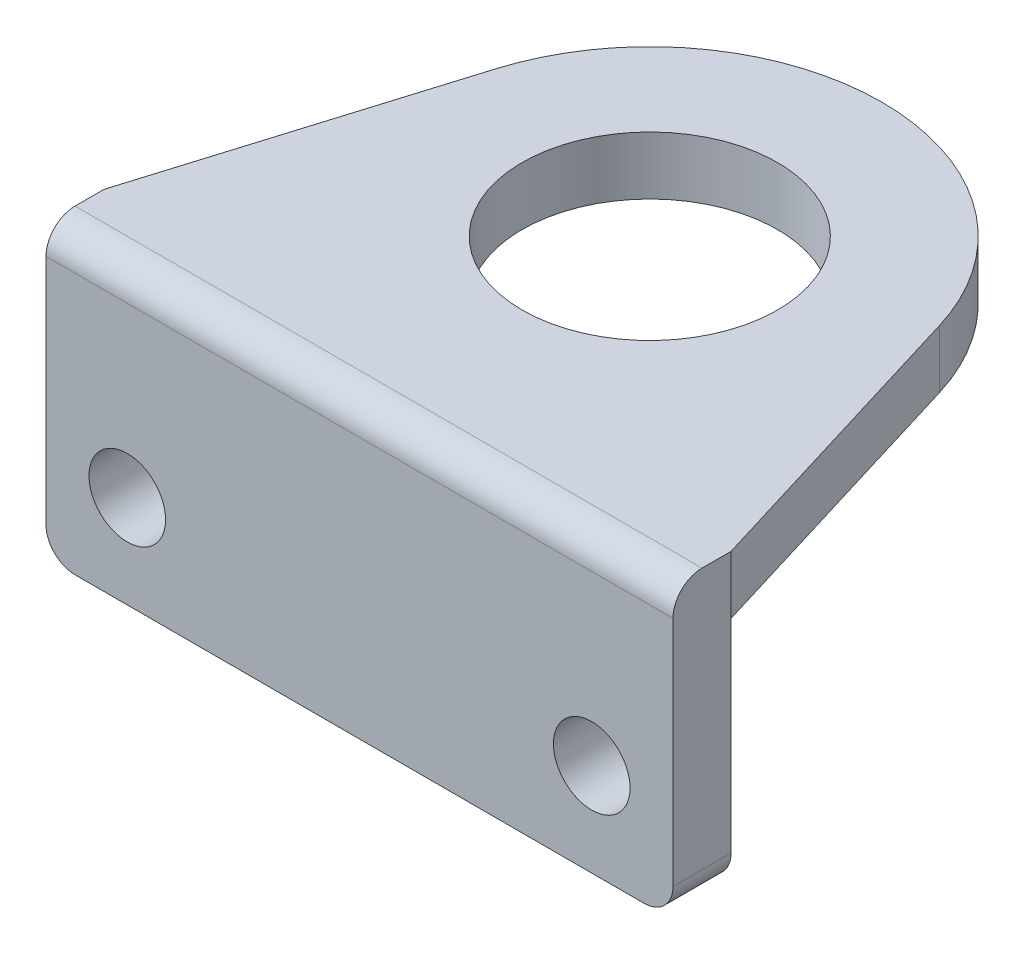
ISO-10303-21;
HEADER;
FILE_DESCRIPTION(('STEP AP214'),'2;1');
FILE_NAME('part.step','',(''),(''),'','','');
FILE_SCHEMA(('AUTOMOTIVE_DESIGN { 1 0 10303 214 1 1 1 1 }'));
ENDSEC;
DATA;
#1=APPLICATION_CONTEXT('core data for automotive mechanical design processes');
#2=APPLICATION_PROTOCOL_DEFINITION('international standard','automotive_design',2000,#1);
#3=PRODUCT_CONTEXT('',#1,'mechanical');
#4=PRODUCT('Part','Part','',(#3));
#5=PRODUCT_RELATED_PRODUCT_CATEGORY('part','',(#4));
#6=PRODUCT_DEFINITION_FORMATION('','',#4);
#7=PRODUCT_DEFINITION_CONTEXT('part definition',#1,'design');
#8=PRODUCT_DEFINITION('design','',#6,#7);
#9=PRODUCT_DEFINITION_SHAPE('','',#8);
#10=(LENGTH_UNIT() NAMED_UNIT(*) SI_UNIT(.MILLI.,.METRE.));
#11=(NAMED_UNIT(*) PLANE_ANGLE_UNIT() SI_UNIT($,.RADIAN.));
#12=(NAMED_UNIT(*) SI_UNIT($,.STERADIAN.) SOLID_ANGLE_UNIT());
#13=UNCERTAINTY_MEASURE_WITH_UNIT(LENGTH_MEASURE(1.E-05),#10,'distance_accuracy_value','');
#14=(GEOMETRIC_REPRESENTATION_CONTEXT(3) GLOBAL_UNCERTAINTY_ASSIGNED_CONTEXT((#13)) GLOBAL_UNIT_ASSIGNED_CONTEXT((#10,
#11,#12)) REPRESENTATION_CONTEXT('',''));
#15=CARTESIAN_POINT('',(0.,0.,0.));
#16=DIRECTION('',(0.,0.,1.));
#17=DIRECTION('',(1.,0.,0.));
#18=AXIS2_PLACEMENT_3D('',#15,#16,#17);
#19=CARTESIAN_POINT('',(27.,-5.,0.));
#20=DIRECTION('',(1.,0.,0.));
#21=DIRECTION('',(0.,0.,-1.));
#22=AXIS2_PLACEMENT_3D('',#19,#20,#21);
#23=PLANE('',#22);
#24=DIRECTION('',(0.,1.,0.));
#25=VECTOR('',#24,1.);
#26=CARTESIAN_POINT('',(27.,-5.,0.));
#27=LINE('',#26,#25);
#28=CARTESIAN_POINT('',(27.,-22.5,0.));
#29=VERTEX_POINT('',#28);
#30=CARTESIAN_POINT('',(27.,-2.5,0.));
#31=VERTEX_POINT('',#30);
#32=EDGE_CURVE('E168',#29,#31,#27,.T.);
#33=ORIENTED_EDGE('',*,*,#32,.F.);
#34=DIRECTION('',(0.,0.,1.));
#35=VECTOR('',#34,1.);
#36=CARTESIAN_POINT('',(27.,-22.5,0.));
#37=LINE('',#36,#35);
#38=CARTESIAN_POINT('',(27.,-22.5,-5.));
#39=VERTEX_POINT('',#38);
#40=EDGE_CURVE('E57',#29,#39,#37,.F.);
#41=ORIENTED_EDGE('',*,*,#40,.T.);
#42=DIRECTION('',(0.,1.,0.));
#43=VECTOR('',#42,1.);
#44=CARTESIAN_POINT('',(27.,0.,-5.));
#45=LINE('',#44,#43);
#46=CARTESIAN_POINT('',(27.,-5.,-5.));
#47=VERTEX_POINT('',#46);
#48=EDGE_CURVE('E133',#39,#47,#45,.T.);
#49=ORIENTED_EDGE('',*,*,#48,.T.);
#50=DIRECTION('',(0.,1.,0.));
#51=VECTOR('',#50,1.);
#52=CARTESIAN_POINT('',(27.,-5.,-5.));
#53=LINE('',#52,#51);
#54=CARTESIAN_POINT('',(27.,0.,-5.));
#55=VERTEX_POINT('',#54);
#56=EDGE_CURVE('E147',#47,#55,#53,.T.);
#57=ORIENTED_EDGE('',*,*,#56,.T.);
#58=DIRECTION('',(0.,0.,-1.));
#59=VECTOR('',#58,1.);
#60=CARTESIAN_POINT('',(27.,0.,0.));
#61=LINE('',#60,#59);
#62=CARTESIAN_POINT('',(27.,0.,-2.5));
#63=VERTEX_POINT('',#62);
#64=EDGE_CURVE('E156',#63,#55,#61,.T.);
#65=ORIENTED_EDGE('',*,*,#64,.F.);
#66=CARTESIAN_POINT('',(27.,-2.5,-2.5));
#67=DIRECTION('',(1.,0.,0.));
#68=DIRECTION('',(0.,0.,-1.));
#69=AXIS2_PLACEMENT_3D('',#66,#67,#68);
#70=CIRCLE('',#69,2.5);
#71=EDGE_CURVE('E176',#63,#31,#70,.T.);
#72=ORIENTED_EDGE('',*,*,#71,.T.);
#73=EDGE_LOOP('',(#33,#41,#49,#57,#65,#72));
#74=FACE_BOUND('',#73,.T.);
#75=ADVANCED_FACE('F34',(#74),#23,.T.);
#76=CARTESIAN_POINT('',(-27.,-5.,0.));
#77=DIRECTION('',(0.,0.,1.));
#78=DIRECTION('',(1.,0.,0.));
#79=AXIS2_PLACEMENT_3D('',#76,#77,#78);
#80=PLANE('',#79);
#81=DIRECTION('',(1.,0.,0.));
#82=VECTOR('',#81,1.);
#83=CARTESIAN_POINT('',(27.,-25.,0.));
#84=LINE('',#83,#82);
#85=CARTESIAN_POINT('',(-24.5,-25.,0.));
#86=VERTEX_POINT('',#85);
#87=CARTESIAN_POINT('',(24.5,-25.,0.));
#88=VERTEX_POINT('',#87);
#89=EDGE_CURVE('E120',#86,#88,#84,.T.);
#90=ORIENTED_EDGE('',*,*,#89,.T.);
#91=CARTESIAN_POINT('',(24.5,-22.5,0.));
#92=DIRECTION('',(0.,0.,1.));
#93=DIRECTION('',(1.,0.,0.));
#94=AXIS2_PLACEMENT_3D('',#91,#92,#93);
#95=CIRCLE('',#94,2.5);
#96=EDGE_CURVE('E191',#88,#29,#95,.T.);
#97=ORIENTED_EDGE('',*,*,#96,.T.);
#98=ORIENTED_EDGE('',*,*,#32,.T.);
#99=DIRECTION('',(1.,0.,0.));
#100=VECTOR('',#99,1.);
#101=CARTESIAN_POINT('',(-27.,-2.5,0.));
#102=LINE('',#101,#100);
#103=CARTESIAN_POINT('',(-27.,-2.5,0.));
#104=VERTEX_POINT('',#103);
#105=EDGE_CURVE('E179',#31,#104,#102,.F.);
#106=ORIENTED_EDGE('',*,*,#105,.T.);
#107=DIRECTION('',(0.,1.,0.));
#108=VECTOR('',#107,1.);
#109=CARTESIAN_POINT('',(-27.,-5.,0.));
#110=LINE('',#109,#108);
#111=CARTESIAN_POINT('',(-27.,-22.5,0.));
#112=VERTEX_POINT('',#111);
#113=EDGE_CURVE('E143',#112,#104,#110,.T.);
#114=ORIENTED_EDGE('',*,*,#113,.F.);
#115=CARTESIAN_POINT('',(-24.5,-22.5,0.));
#116=DIRECTION('',(0.,0.,1.));
#117=DIRECTION('',(1.,0.,0.));
#118=AXIS2_PLACEMENT_3D('',#115,#116,#117);
#119=CIRCLE('',#118,2.5);
#120=EDGE_CURVE('E189',#112,#86,#119,.T.);
#121=ORIENTED_EDGE('',*,*,#120,.T.);
#122=EDGE_LOOP('',(#90,#97,#98,#106,#114,#121));
#123=FACE_BOUND('',#122,.T.);
#124=CARTESIAN_POINT('',(-20.,-17.,0.));
#125=DIRECTION('',(0.,0.,1.));
#126=DIRECTION('',(1.,0.,0.));
#127=AXIS2_PLACEMENT_3D('',#124,#125,#126);
#128=CIRCLE('',#127,3.3);
#129=CARTESIAN_POINT('',(-16.7,-17.,0.));
#130=VERTEX_POINT('',#129);
#131=EDGE_CURVE('E289',#130,#130,#128,.T.);
#132=ORIENTED_EDGE('',*,*,#131,.F.);
#133=EDGE_LOOP('',(#132));
#134=FACE_BOUND('',#133,.T.);
#135=CARTESIAN_POINT('',(20.,-17.,0.));
#136=DIRECTION('',(0.,0.,1.));
#137=DIRECTION('',(1.,0.,0.));
#138=AXIS2_PLACEMENT_3D('',#135,#136,#137);
#139=CIRCLE('',#138,3.3);
#140=CARTESIAN_POINT('',(23.3,-17.,0.));
#141=VERTEX_POINT('',#140);
#142=EDGE_CURVE('E283',#141,#141,#139,.T.);
#143=ORIENTED_EDGE('',*,*,#142,.F.);
#144=EDGE_LOOP('',(#143));
#145=FACE_BOUND('',#144,.T.);
#146=ADVANCED_FACE('F206',(#123,#134,#145),#80,.T.);
#147=CARTESIAN_POINT('',(-27.,-5.,0.));
#148=DIRECTION('',(-1.,0.,0.));
#149=DIRECTION('',(0.,0.,1.));
#150=AXIS2_PLACEMENT_3D('',#147,#148,#149);
#151=PLANE('',#150);
#152=DIRECTION('',(0.,-1.,0.));
#153=VECTOR('',#152,1.);
#154=CARTESIAN_POINT('',(-27.,-25.,-5.));
#155=LINE('',#154,#153);
#156=CARTESIAN_POINT('',(-27.,-5.,-5.));
#157=VERTEX_POINT('',#156);
#158=CARTESIAN_POINT('',(-27.,-22.5,-5.));
#159=VERTEX_POINT('',#158);
#160=EDGE_CURVE('E111',#157,#159,#155,.T.);
#161=ORIENTED_EDGE('',*,*,#160,.T.);
#162=DIRECTION('',(0.,0.,1.));
#163=VECTOR('',#162,1.);
#164=CARTESIAN_POINT('',(-27.,-22.5,0.));
#165=LINE('',#164,#163);
#166=EDGE_CURVE('E11',#159,#112,#165,.T.);
#167=ORIENTED_EDGE('',*,*,#166,.T.);
#168=ORIENTED_EDGE('',*,*,#113,.T.);
#169=CARTESIAN_POINT('',(-27.,-2.5,-2.5));
#170=DIRECTION('',(-1.,0.,0.));
#171=DIRECTION('',(0.,0.,1.));
#172=AXIS2_PLACEMENT_3D('',#169,#170,#171);
#173=CIRCLE('',#172,2.5);
#174=CARTESIAN_POINT('',(-27.,0.,-2.5));
#175=VERTEX_POINT('',#174);
#176=EDGE_CURVE('E182',#104,#175,#173,.T.);
#177=ORIENTED_EDGE('',*,*,#176,.T.);
#178=DIRECTION('',(0.,0.,1.));
#179=VECTOR('',#178,1.);
#180=CARTESIAN_POINT('',(-27.,0.,0.));
#181=LINE('',#180,#179);
#182=CARTESIAN_POINT('',(-27.,0.,-5.));
#183=VERTEX_POINT('',#182);
#184=EDGE_CURVE('E139',#183,#175,#181,.T.);
#185=ORIENTED_EDGE('',*,*,#184,.F.);
#186=DIRECTION('',(0.,1.,0.));
#187=VECTOR('',#186,1.);
#188=CARTESIAN_POINT('',(-27.,-5.,-5.));
#189=LINE('',#188,#187);
#190=EDGE_CURVE('E136',#157,#183,#189,.T.);
#191=ORIENTED_EDGE('',*,*,#190,.F.);
#192=EDGE_LOOP('',(#161,#167,#168,#177,#185,#191));
#193=FACE_BOUND('',#192,.T.);
#194=ADVANCED_FACE('F137',(#193),#151,.T.);
#195=CARTESIAN_POINT('',(-27.,-5.,-5.));
#196=DIRECTION('',(-0.95659875996457,0.,-0.29140832595217));
#197=DIRECTION('',(-0.29140832595217,0.,0.95659875996457));
#198=AXIS2_PLACEMENT_3D('',#195,#196,#197);
#199=PLANE('',#198);
#200=DIRECTION('',(-0.29140832595217,0.,0.95659875996457));
#201=VECTOR('',#200,1.);
#202=CARTESIAN_POINT('',(-27.,0.,-5.));
#203=LINE('',#202,#201);
#204=CARTESIAN_POINT('',(-19.1319751992914,0.,-30.8281665190434));
#205=VERTEX_POINT('',#204);
#206=EDGE_CURVE('E165',#205,#183,#203,.T.);
#207=ORIENTED_EDGE('',*,*,#206,.F.);
#208=DIRECTION('',(0.,1.,0.));
#209=VECTOR('',#208,1.);
#210=CARTESIAN_POINT('',(-19.1319751992914,-5.,-30.8281665190434));
#211=LINE('',#210,#209);
#212=CARTESIAN_POINT('',(-19.1319751992914,-5.,-30.8281665190434));
#213=VERTEX_POINT('',#212);
#214=EDGE_CURVE('E144',#213,#205,#211,.T.);
#215=ORIENTED_EDGE('',*,*,#214,.F.);
#216=DIRECTION('',(-0.29140832595217,0.,0.95659875996457));
#217=VECTOR('',#216,1.);
#218=CARTESIAN_POINT('',(-27.,-5.,-5.));
#219=LINE('',#218,#217);
#220=EDGE_CURVE('E128',#213,#157,#219,.T.);
#221=ORIENTED_EDGE('',*,*,#220,.T.);
#222=ORIENTED_EDGE('',*,*,#190,.T.);
#223=EDGE_LOOP('',(#207,#215,#221,#222));
#224=FACE_BOUND('',#223,.T.);
#225=ADVANCED_FACE('F146',(#224),#199,.T.);
#226=CARTESIAN_POINT('',(0.,-5.,-25.));
#227=DIRECTION('',(0.,1.,0.));
#228=DIRECTION('',(0.,0.,1.));
#229=AXIS2_PLACEMENT_3D('',#226,#227,#228);
#230=CYLINDRICAL_SURFACE('',#229,20.);
#231=CARTESIAN_POINT('',(0.,0.,-25.));
#232=DIRECTION('',(0.,1.,0.));
#233=DIRECTION('',(0.,0.,1.));
#234=AXIS2_PLACEMENT_3D('',#231,#232,#233);
#235=CIRCLE('',#234,20.);
#236=CARTESIAN_POINT('',(19.1319751992914,0.,-30.8281665190434));
#237=VERTEX_POINT('',#236);
#238=EDGE_CURVE('E162',#237,#205,#235,.T.);
#239=ORIENTED_EDGE('',*,*,#238,.F.);
#240=DIRECTION('',(0.,1.,0.));
#241=VECTOR('',#240,1.);
#242=CARTESIAN_POINT('',(19.1319751992914,-5.,-30.8281665190434));
#243=LINE('',#242,#241);
#244=CARTESIAN_POINT('',(19.1319751992914,-5.,-30.8281665190434));
#245=VERTEX_POINT('',#244);
#246=EDGE_CURVE('E151',#245,#237,#243,.T.);
#247=ORIENTED_EDGE('',*,*,#246,.F.);
#248=CARTESIAN_POINT('',(0.,-5.,-25.));
#249=DIRECTION('',(0.,1.,0.));
#250=DIRECTION('',(0.,0.,1.));
#251=AXIS2_PLACEMENT_3D('',#248,#249,#250);
#252=CIRCLE('',#251,20.);
#253=EDGE_CURVE('E148',#245,#213,#252,.T.);
#254=ORIENTED_EDGE('',*,*,#253,.T.);
#255=ORIENTED_EDGE('',*,*,#214,.T.);
#256=EDGE_LOOP('',(#239,#247,#254,#255));
#257=FACE_BOUND('',#256,.T.);
#258=ADVANCED_FACE('F265',(#257),#230,.T.);
#259=CARTESIAN_POINT('',(27.,-5.,-5.));
#260=DIRECTION('',(0.95659875996457,0.,-0.29140832595217));
#261=DIRECTION('',(-0.29140832595217,0.,-0.95659875996457));
#262=AXIS2_PLACEMENT_3D('',#259,#260,#261);
#263=PLANE('',#262);
#264=DIRECTION('',(-0.29140832595217,0.,-0.95659875996457));
#265=VECTOR('',#264,1.);
#266=CARTESIAN_POINT('',(27.,0.,-5.));
#267=LINE('',#266,#265);
#268=EDGE_CURVE('E158',#55,#237,#267,.T.);
#269=ORIENTED_EDGE('',*,*,#268,.F.);
#270=ORIENTED_EDGE('',*,*,#56,.F.);
#271=DIRECTION('',(-0.29140832595217,0.,-0.95659875996457));
#272=VECTOR('',#271,1.);
#273=CARTESIAN_POINT('',(27.,-5.,-5.));
#274=LINE('',#273,#272);
#275=EDGE_CURVE('E131',#47,#245,#274,.T.);
#276=ORIENTED_EDGE('',*,*,#275,.T.);
#277=ORIENTED_EDGE('',*,*,#246,.T.);
#278=EDGE_LOOP('',(#269,#270,#276,#277));
#279=FACE_BOUND('',#278,.T.);
#280=ADVANCED_FACE('F228',(#279),#263,.T.);
#281=CARTESIAN_POINT('',(0.,-5.,-25.));
#282=DIRECTION('',(0.,1.,0.));
#283=DIRECTION('',(0.,0.,1.));
#284=AXIS2_PLACEMENT_3D('',#281,#282,#283);
#285=PLANE('',#284);
#286=CARTESIAN_POINT('',(0.,-5.,-25.));
#287=DIRECTION('',(0.,1.,0.));
#288=DIRECTION('',(0.,0.,1.));
#289=AXIS2_PLACEMENT_3D('',#286,#287,#288);
#290=CIRCLE('',#289,11.);
#291=CARTESIAN_POINT('',(0.,-5.,-14.));
#292=VERTEX_POINT('',#291);
#293=EDGE_CURVE('E159',#292,#292,#290,.T.);
#294=ORIENTED_EDGE('',*,*,#293,.T.);
#295=EDGE_LOOP('',(#294));
#296=FACE_BOUND('',#295,.T.);
#297=ORIENTED_EDGE('',*,*,#275,.F.);
#298=DIRECTION('',(-1.,0.,0.));
#299=VECTOR('',#298,1.);
#300=CARTESIAN_POINT('',(0.,-5.,-5.));
#301=LINE('',#300,#299);
#302=EDGE_CURVE('E114',#47,#157,#301,.T.);
#303=ORIENTED_EDGE('',*,*,#302,.T.);
#304=ORIENTED_EDGE('',*,*,#220,.F.);
#305=ORIENTED_EDGE('',*,*,#253,.F.);
#306=EDGE_LOOP('',(#297,#303,#304,#305));
#307=FACE_BOUND('',#306,.T.);
#308=ADVANCED_FACE('F125',(#296,#307),#285,.F.);
#309=CARTESIAN_POINT('',(0.,0.,-25.));
#310=DIRECTION('',(0.,1.,0.));
#311=DIRECTION('',(0.,0.,1.));
#312=AXIS2_PLACEMENT_3D('',#309,#310,#311);
#313=PLANE('',#312);
#314=ORIENTED_EDGE('',*,*,#184,.T.);
#315=DIRECTION('',(1.,0.,0.));
#316=VECTOR('',#315,1.);
#317=CARTESIAN_POINT('',(0.,0.,-2.5));
#318=LINE('',#317,#316);
#319=EDGE_CURVE('E170',#175,#63,#318,.T.);
#320=ORIENTED_EDGE('',*,*,#319,.T.);
#321=ORIENTED_EDGE('',*,*,#64,.T.);
#322=ORIENTED_EDGE('',*,*,#268,.T.);
#323=ORIENTED_EDGE('',*,*,#238,.T.);
#324=ORIENTED_EDGE('',*,*,#206,.T.);
#325=EDGE_LOOP('',(#314,#320,#321,#322,#323,#324));
#326=FACE_BOUND('',#325,.T.);
#327=CARTESIAN_POINT('',(0.,0.,-25.));
#328=DIRECTION('',(0.,1.,0.));
#329=DIRECTION('',(0.,0.,1.));
#330=AXIS2_PLACEMENT_3D('',#327,#328,#329);
#331=CIRCLE('',#330,11.);
#332=CARTESIAN_POINT('',(0.,0.,-14.));
#333=VERTEX_POINT('',#332);
#334=EDGE_CURVE('E132',#333,#333,#331,.T.);
#335=ORIENTED_EDGE('',*,*,#334,.F.);
#336=EDGE_LOOP('',(#335));
#337=FACE_BOUND('',#336,.T.);
#338=ADVANCED_FACE('F254',(#326,#337),#313,.T.);
#339=CARTESIAN_POINT('',(0.,-5.,-25.));
#340=DIRECTION('',(0.,1.,0.));
#341=DIRECTION('',(0.,0.,1.));
#342=AXIS2_PLACEMENT_3D('',#339,#340,#341);
#343=CYLINDRICAL_SURFACE('',#342,11.);
#344=ORIENTED_EDGE('',*,*,#293,.F.);
#345=EDGE_LOOP('',(#344));
#346=FACE_BOUND('',#345,.T.);
#347=ORIENTED_EDGE('',*,*,#334,.T.);
#348=EDGE_LOOP('',(#347));
#349=FACE_BOUND('',#348,.T.);
#350=ADVANCED_FACE('F248',(#346,#349),#343,.F.);
#351=CARTESIAN_POINT('',(0.,0.,-5.));
#352=DIRECTION('',(0.,0.,-1.));
#353=DIRECTION('',(-1.,0.,0.));
#354=AXIS2_PLACEMENT_3D('',#351,#352,#353);
#355=PLANE('',#354);
#356=CARTESIAN_POINT('',(20.,-17.,-5.));
#357=DIRECTION('',(0.,0.,1.));
#358=DIRECTION('',(1.,0.,0.));
#359=AXIS2_PLACEMENT_3D('',#356,#357,#358);
#360=CIRCLE('',#359,3.3);
#361=CARTESIAN_POINT('',(23.3,-17.,-5.));
#362=VERTEX_POINT('',#361);
#363=EDGE_CURVE('E281',#362,#362,#360,.T.);
#364=ORIENTED_EDGE('',*,*,#363,.T.);
#365=EDGE_LOOP('',(#364));
#366=FACE_BOUND('',#365,.T.);
#367=CARTESIAN_POINT('',(-20.,-17.,-5.));
#368=DIRECTION('',(0.,0.,1.));
#369=DIRECTION('',(1.,0.,0.));
#370=AXIS2_PLACEMENT_3D('',#367,#368,#369);
#371=CIRCLE('',#370,3.3);
#372=CARTESIAN_POINT('',(-16.7,-17.,-5.));
#373=VERTEX_POINT('',#372);
#374=EDGE_CURVE('E286',#373,#373,#371,.T.);
#375=ORIENTED_EDGE('',*,*,#374,.T.);
#376=EDGE_LOOP('',(#375));
#377=FACE_BOUND('',#376,.T.);
#378=ORIENTED_EDGE('',*,*,#48,.F.);
#379=CARTESIAN_POINT('',(24.5,-22.5,-5.));
#380=DIRECTION('',(0.,0.,-1.));
#381=DIRECTION('',(-1.,0.,0.));
#382=AXIS2_PLACEMENT_3D('',#379,#380,#381);
#383=CIRCLE('',#382,2.5);
#384=CARTESIAN_POINT('',(24.5,-25.,-5.));
#385=VERTEX_POINT('',#384);
#386=EDGE_CURVE('E42',#39,#385,#383,.T.);
#387=ORIENTED_EDGE('',*,*,#386,.T.);
#388=DIRECTION('',(1.,0.,0.));
#389=VECTOR('',#388,1.);
#390=CARTESIAN_POINT('',(27.,-25.,-5.));
#391=LINE('',#390,#389);
#392=CARTESIAN_POINT('',(-24.5,-25.,-5.));
#393=VERTEX_POINT('',#392);
#394=EDGE_CURVE('E119',#393,#385,#391,.T.);
#395=ORIENTED_EDGE('',*,*,#394,.F.);
#396=CARTESIAN_POINT('',(-24.5,-22.5,-5.));
#397=DIRECTION('',(0.,0.,-1.));
#398=DIRECTION('',(-1.,0.,0.));
#399=AXIS2_PLACEMENT_3D('',#396,#397,#398);
#400=CIRCLE('',#399,2.5);
#401=EDGE_CURVE('E49',#393,#159,#400,.T.);
#402=ORIENTED_EDGE('',*,*,#401,.T.);
#403=ORIENTED_EDGE('',*,*,#160,.F.);
#404=ORIENTED_EDGE('',*,*,#302,.F.);
#405=EDGE_LOOP('',(#378,#387,#395,#402,#403,#404));
#406=FACE_BOUND('',#405,.T.);
#407=ADVANCED_FACE('F113',(#366,#377,#406),#355,.T.);
#408=CARTESIAN_POINT('',(27.,-25.,-5.));
#409=DIRECTION('',(0.,-1.,0.));
#410=DIRECTION('',(1.,0.,0.));
#411=AXIS2_PLACEMENT_3D('',#408,#409,#410);
#412=PLANE('',#411);
#413=ORIENTED_EDGE('',*,*,#394,.T.);
#414=DIRECTION('',(0.,0.,1.));
#415=VECTOR('',#414,1.);
#416=CARTESIAN_POINT('',(24.5,-25.,-5.));
#417=LINE('',#416,#415);
#418=EDGE_CURVE('E186',#385,#88,#417,.T.);
#419=ORIENTED_EDGE('',*,*,#418,.T.);
#420=ORIENTED_EDGE('',*,*,#89,.F.);
#421=DIRECTION('',(0.,0.,1.));
#422=VECTOR('',#421,1.);
#423=CARTESIAN_POINT('',(-24.5,-25.,-5.));
#424=LINE('',#423,#422);
#425=EDGE_CURVE('E184',#86,#393,#424,.F.);
#426=ORIENTED_EDGE('',*,*,#425,.T.);
#427=EDGE_LOOP('',(#413,#419,#420,#426));
#428=FACE_BOUND('',#427,.T.);
#429=ADVANCED_FACE('F199',(#428),#412,.T.);
#430=CARTESIAN_POINT('',(20.,-17.,-5.));
#431=DIRECTION('',(0.,0.,1.));
#432=DIRECTION('',(1.,0.,0.));
#433=AXIS2_PLACEMENT_3D('',#430,#431,#432);
#434=CYLINDRICAL_SURFACE('',#433,3.3);
#435=ORIENTED_EDGE('',*,*,#363,.F.);
#436=EDGE_LOOP('',(#435));
#437=FACE_BOUND('',#436,.T.);
#438=ORIENTED_EDGE('',*,*,#142,.T.);
#439=EDGE_LOOP('',(#438));
#440=FACE_BOUND('',#439,.T.);
#441=ADVANCED_FACE('F235',(#437,#440),#434,.F.);
#442=CARTESIAN_POINT('',(-20.,-17.,-5.));
#443=DIRECTION('',(0.,0.,1.));
#444=DIRECTION('',(1.,0.,0.));
#445=AXIS2_PLACEMENT_3D('',#442,#443,#444);
#446=CYLINDRICAL_SURFACE('',#445,3.3);
#447=ORIENTED_EDGE('',*,*,#374,.F.);
#448=EDGE_LOOP('',(#447));
#449=FACE_BOUND('',#448,.T.);
#450=ORIENTED_EDGE('',*,*,#131,.T.);
#451=EDGE_LOOP('',(#450));
#452=FACE_BOUND('',#451,.T.);
#453=ADVANCED_FACE('F231',(#449,#452),#446,.F.);
#454=CARTESIAN_POINT('',(0.,-2.5,-2.5));
#455=DIRECTION('',(1.,0.,0.));
#456=DIRECTION('',(0.,0.,-1.));
#457=AXIS2_PLACEMENT_3D('',#454,#455,#456);
#458=CYLINDRICAL_SURFACE('',#457,2.5);
#459=ORIENTED_EDGE('',*,*,#176,.F.);
#460=ORIENTED_EDGE('',*,*,#105,.F.);
#461=ORIENTED_EDGE('',*,*,#71,.F.);
#462=ORIENTED_EDGE('',*,*,#319,.F.);
#463=EDGE_LOOP('',(#459,#460,#461,#462));
#464=FACE_BOUND('',#463,.T.);
#465=ADVANCED_FACE('F213',(#464),#458,.T.);
#466=CARTESIAN_POINT('',(24.5,-22.5,-5.));
#467=DIRECTION('',(0.,0.,1.));
#468=DIRECTION('',(1.,0.,0.));
#469=AXIS2_PLACEMENT_3D('',#466,#467,#468);
#470=CYLINDRICAL_SURFACE('',#469,2.5);
#471=ORIENTED_EDGE('',*,*,#386,.F.);
#472=ORIENTED_EDGE('',*,*,#40,.F.);
#473=ORIENTED_EDGE('',*,*,#96,.F.);
#474=ORIENTED_EDGE('',*,*,#418,.F.);
#475=EDGE_LOOP('',(#471,#472,#473,#474));
#476=FACE_BOUND('',#475,.T.);
#477=ADVANCED_FACE('F204',(#476),#470,.T.);
#478=CARTESIAN_POINT('',(-24.5,-22.5,0.));
#479=DIRECTION('',(0.,0.,1.));
#480=DIRECTION('',(1.,0.,0.));
#481=AXIS2_PLACEMENT_3D('',#478,#479,#480);
#482=CYLINDRICAL_SURFACE('',#481,2.5);
#483=ORIENTED_EDGE('',*,*,#401,.F.);
#484=ORIENTED_EDGE('',*,*,#425,.F.);
#485=ORIENTED_EDGE('',*,*,#120,.F.);
#486=ORIENTED_EDGE('',*,*,#166,.F.);
#487=EDGE_LOOP('',(#483,#484,#485,#486));
#488=FACE_BOUND('',#487,.T.);
#489=ADVANCED_FACE('F36',(#488),#482,.T.);
#490=CLOSED_SHELL('',(#75,#146,#194,#225,#258,#280,#308,#338,#350,#407,#429,#441,#453,#465,#477,#489));
#491=MANIFOLD_SOLID_BREP('B2',#490);
#492=ADVANCED_BREP_SHAPE_REPRESENTATION('',(#18,#491),#14);
#493=SHAPE_DEFINITION_REPRESENTATION(#9,#492);
ENDSEC;
END-ISO-10303-21;
